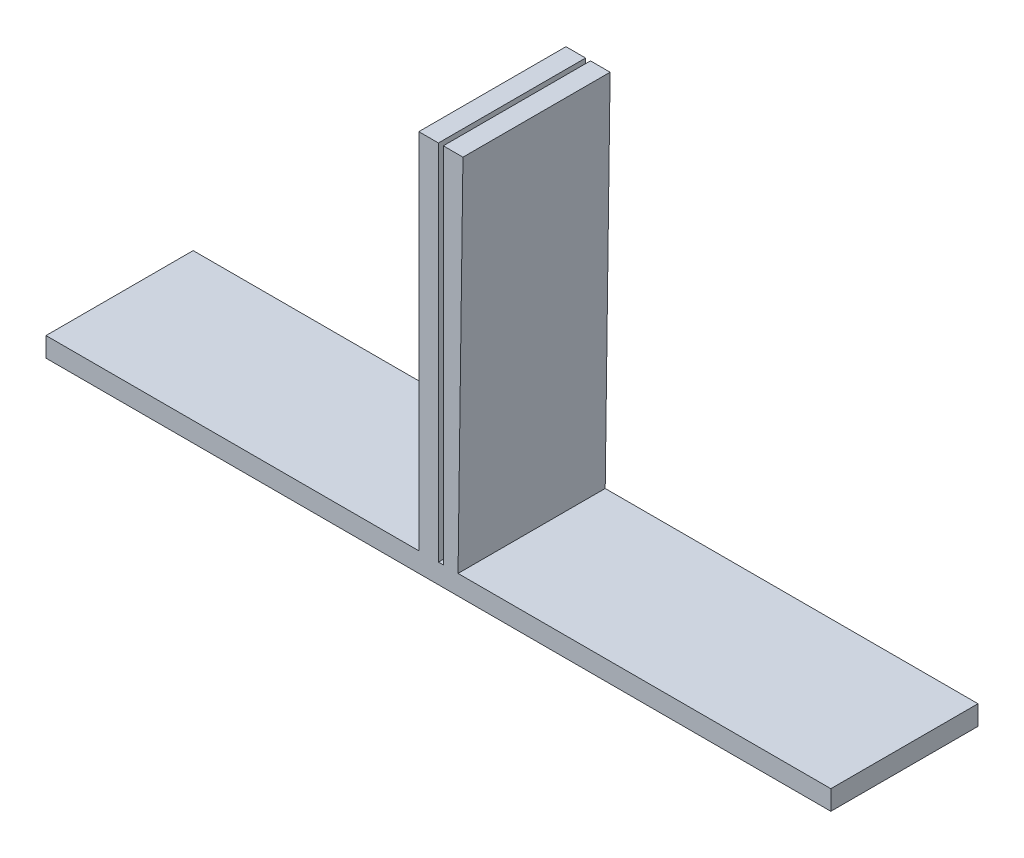
ISO-10303-21;
HEADER;
FILE_DESCRIPTION(('STEP AP214'),'2;1');
FILE_NAME('part.step','',(''),(''),'','','');
FILE_SCHEMA(('AUTOMOTIVE_DESIGN { 1 0 10303 214 1 1 1 1 }'));
ENDSEC;
DATA;
#1=APPLICATION_CONTEXT('core data for automotive mechanical design processes');
#2=APPLICATION_PROTOCOL_DEFINITION('international standard','automotive_design',2000,#1);
#3=PRODUCT_CONTEXT('',#1,'mechanical');
#4=PRODUCT('Part','Part','',(#3));
#5=PRODUCT_RELATED_PRODUCT_CATEGORY('part','',(#4));
#6=PRODUCT_DEFINITION_FORMATION('','',#4);
#7=PRODUCT_DEFINITION_CONTEXT('part definition',#1,'design');
#8=PRODUCT_DEFINITION('design','',#6,#7);
#9=PRODUCT_DEFINITION_SHAPE('','',#8);
#10=(LENGTH_UNIT() NAMED_UNIT(*) SI_UNIT(.MILLI.,.METRE.));
#11=(NAMED_UNIT(*) PLANE_ANGLE_UNIT() SI_UNIT($,.RADIAN.));
#12=(NAMED_UNIT(*) SI_UNIT($,.STERADIAN.) SOLID_ANGLE_UNIT());
#13=UNCERTAINTY_MEASURE_WITH_UNIT(LENGTH_MEASURE(1.E-05),#10,'distance_accuracy_value','');
#14=(GEOMETRIC_REPRESENTATION_CONTEXT(3) GLOBAL_UNCERTAINTY_ASSIGNED_CONTEXT((#13)) GLOBAL_UNIT_ASSIGNED_CONTEXT((#10,
#11,#12)) REPRESENTATION_CONTEXT('',''));
#15=CARTESIAN_POINT('',(0.,0.,0.));
#16=DIRECTION('',(0.,0.,1.));
#17=DIRECTION('',(1.,0.,0.));
#18=AXIS2_PLACEMENT_3D('',#15,#16,#17);
#19=CARTESIAN_POINT('',(37.1967164120741,0.,15.));
#20=DIRECTION('',(-1.,0.,0.));
#21=DIRECTION('',(0.,0.,1.));
#22=AXIS2_PLACEMENT_3D('',#19,#20,#21);
#23=PLANE('',#22);
#24=DIRECTION('',(0.,1.,0.));
#25=VECTOR('',#24,1.);
#26=CARTESIAN_POINT('',(37.1967164120741,0.,0.));
#27=LINE('',#26,#25);
#28=CARTESIAN_POINT('',(37.1967164120741,0.,0.));
#29=VERTEX_POINT('',#28);
#30=CARTESIAN_POINT('',(37.1967164120741,2.,0.));
#31=VERTEX_POINT('',#30);
#32=EDGE_CURVE('E153',#29,#31,#27,.T.);
#33=ORIENTED_EDGE('',*,*,#32,.T.);
#34=DIRECTION('',(0.,0.,-1.));
#35=VECTOR('',#34,1.);
#36=CARTESIAN_POINT('',(37.1967164120741,2.,15.));
#37=LINE('',#36,#35);
#38=CARTESIAN_POINT('',(37.1967164120741,2.,15.));
#39=VERTEX_POINT('',#38);
#40=EDGE_CURVE('E11',#39,#31,#37,.T.);
#41=ORIENTED_EDGE('',*,*,#40,.F.);
#42=DIRECTION('',(0.,1.,0.));
#43=VECTOR('',#42,1.);
#44=CARTESIAN_POINT('',(37.1967164120741,0.,15.));
#45=LINE('',#44,#43);
#46=CARTESIAN_POINT('',(37.1967164120741,0.,15.));
#47=VERTEX_POINT('',#46);
#48=EDGE_CURVE('E175',#47,#39,#45,.T.);
#49=ORIENTED_EDGE('',*,*,#48,.F.);
#50=DIRECTION('',(0.,0.,-1.));
#51=VECTOR('',#50,1.);
#52=CARTESIAN_POINT('',(37.1967164120741,0.,15.));
#53=LINE('',#52,#51);
#54=EDGE_CURVE('E149',#47,#29,#53,.T.);
#55=ORIENTED_EDGE('',*,*,#54,.T.);
#56=EDGE_LOOP('',(#33,#41,#49,#55));
#57=FACE_BOUND('',#56,.T.);
#58=ADVANCED_FACE('F33',(#57),#23,.F.);
#59=CARTESIAN_POINT('',(37.1967164120741,2.,15.));
#60=DIRECTION('',(0.,-1.,0.));
#61=DIRECTION('',(1.,0.,0.));
#62=AXIS2_PLACEMENT_3D('',#59,#60,#61);
#63=PLANE('',#62);
#64=DIRECTION('',(-1.,0.,0.));
#65=VECTOR('',#64,1.);
#66=CARTESIAN_POINT('',(37.1967164120741,2.,0.));
#67=LINE('',#66,#65);
#68=CARTESIAN_POINT('',(-0.803283587925897,2.,0.));
#69=VERTEX_POINT('',#68);
#70=EDGE_CURVE('E156',#31,#69,#67,.T.);
#71=ORIENTED_EDGE('',*,*,#70,.T.);
#72=DIRECTION('',(0.,0.,-1.));
#73=VECTOR('',#72,1.);
#74=CARTESIAN_POINT('',(-0.803283587925897,2.,15.));
#75=LINE('',#74,#73);
#76=CARTESIAN_POINT('',(-0.803283587925897,2.,15.));
#77=VERTEX_POINT('',#76);
#78=EDGE_CURVE('E41',#77,#69,#75,.T.);
#79=ORIENTED_EDGE('',*,*,#78,.F.);
#80=DIRECTION('',(-1.,0.,0.));
#81=VECTOR('',#80,1.);
#82=CARTESIAN_POINT('',(37.1967164120741,2.,15.));
#83=LINE('',#82,#81);
#84=EDGE_CURVE('E104',#39,#77,#83,.T.);
#85=ORIENTED_EDGE('',*,*,#84,.F.);
#86=ORIENTED_EDGE('',*,*,#40,.T.);
#87=EDGE_LOOP('',(#71,#79,#85,#86));
#88=FACE_BOUND('',#87,.T.);
#89=ADVANCED_FACE('F253',(#88),#63,.F.);
#90=CARTESIAN_POINT('',(-0.803283587925897,2.,15.));
#91=DIRECTION('',(-0.999908689349645,0.0135134363903355,0.));
#92=DIRECTION('',(-0.0135134363903355,-0.999908689349645,0.));
#93=AXIS2_PLACEMENT_3D('',#90,#91,#92);
#94=PLANE('',#93);
#95=DIRECTION('',(0.0135134363903355,0.999908689349645,0.));
#96=VECTOR('',#95,1.);
#97=CARTESIAN_POINT('',(-0.803283587925897,2.,0.));
#98=LINE('',#97,#96);
#99=CARTESIAN_POINT('',(-0.303286441483485,38.9966215059369,0.));
#100=VERTEX_POINT('',#99);
#101=EDGE_CURVE('E158',#69,#100,#98,.T.);
#102=ORIENTED_EDGE('',*,*,#101,.T.);
#103=DIRECTION('',(0.,0.,-1.));
#104=VECTOR('',#103,1.);
#105=CARTESIAN_POINT('',(-0.303286441483485,38.9966215059369,15.));
#106=LINE('',#105,#104);
#107=CARTESIAN_POINT('',(-0.303286441483485,38.9966215059369,15.));
#108=VERTEX_POINT('',#107);
#109=EDGE_CURVE('E194',#108,#100,#106,.T.);
#110=ORIENTED_EDGE('',*,*,#109,.F.);
#111=DIRECTION('',(0.0135134363903355,0.999908689349645,0.));
#112=VECTOR('',#111,1.);
#113=CARTESIAN_POINT('',(-0.803283587925897,2.,15.));
#114=LINE('',#113,#112);
#115=EDGE_CURVE('E202',#77,#108,#114,.T.);
#116=ORIENTED_EDGE('',*,*,#115,.F.);
#117=ORIENTED_EDGE('',*,*,#78,.T.);
#118=EDGE_LOOP('',(#102,#110,#116,#117));
#119=FACE_BOUND('',#118,.T.);
#120=ADVANCED_FACE('F200',(#119),#94,.F.);
#121=CARTESIAN_POINT('',(-0.303286441483485,38.9966215059369,15.));
#122=DIRECTION('',(-0.00168924703157144,-0.999998573221215,0.));
#123=DIRECTION('',(0.999998573221215,-0.00168924703157144,0.));
#124=AXIS2_PLACEMENT_3D('',#121,#122,#123);
#125=PLANE('',#124);
#126=DIRECTION('',(-0.999998573221215,0.00168924703157144,0.));
#127=VECTOR('',#126,1.);
#128=CARTESIAN_POINT('',(-0.303286441483485,38.9966215059369,0.));
#129=LINE('',#128,#127);
#130=CARTESIAN_POINT('',(-2.30328358792592,39.,0.));
#131=VERTEX_POINT('',#130);
#132=EDGE_CURVE('E160',#100,#131,#129,.T.);
#133=ORIENTED_EDGE('',*,*,#132,.T.);
#134=DIRECTION('',(0.,0.,-1.));
#135=VECTOR('',#134,1.);
#136=CARTESIAN_POINT('',(-2.30328358792592,39.,15.));
#137=LINE('',#136,#135);
#138=CARTESIAN_POINT('',(-2.30328358792592,39.,15.));
#139=VERTEX_POINT('',#138);
#140=EDGE_CURVE('E191',#139,#131,#137,.T.);
#141=ORIENTED_EDGE('',*,*,#140,.F.);
#142=DIRECTION('',(-0.999998573221215,0.00168924703157144,0.));
#143=VECTOR('',#142,1.);
#144=CARTESIAN_POINT('',(-0.303286441483485,38.9966215059369,15.));
#145=LINE('',#144,#143);
#146=EDGE_CURVE('E220',#108,#139,#145,.T.);
#147=ORIENTED_EDGE('',*,*,#146,.F.);
#148=ORIENTED_EDGE('',*,*,#109,.T.);
#149=EDGE_LOOP('',(#133,#141,#147,#148));
#150=FACE_BOUND('',#149,.T.);
#151=ADVANCED_FACE('F211',(#150),#125,.F.);
#152=CARTESIAN_POINT('',(-2.30328358792592,39.,15.));
#153=DIRECTION('',(1.,0.,0.));
#154=DIRECTION('',(0.,0.,-1.));
#155=AXIS2_PLACEMENT_3D('',#152,#153,#154);
#156=PLANE('',#155);
#157=DIRECTION('',(0.,-1.,0.));
#158=VECTOR('',#157,1.);
#159=CARTESIAN_POINT('',(-2.30328358792592,39.,0.));
#160=LINE('',#159,#158);
#161=CARTESIAN_POINT('',(-2.30328358792592,1.99999999999999,0.));
#162=VERTEX_POINT('',#161);
#163=EDGE_CURVE('E162',#131,#162,#160,.T.);
#164=ORIENTED_EDGE('',*,*,#163,.T.);
#165=DIRECTION('',(0.,0.,-1.));
#166=VECTOR('',#165,1.);
#167=CARTESIAN_POINT('',(-2.30328358792592,1.99999999999999,15.));
#168=LINE('',#167,#166);
#169=CARTESIAN_POINT('',(-2.30328358792592,1.99999999999999,15.));
#170=VERTEX_POINT('',#169);
#171=EDGE_CURVE('E188',#170,#162,#168,.T.);
#172=ORIENTED_EDGE('',*,*,#171,.F.);
#173=DIRECTION('',(0.,-1.,0.));
#174=VECTOR('',#173,1.);
#175=CARTESIAN_POINT('',(-2.30328358792592,39.,15.));
#176=LINE('',#175,#174);
#177=EDGE_CURVE('E217',#139,#170,#176,.T.);
#178=ORIENTED_EDGE('',*,*,#177,.F.);
#179=ORIENTED_EDGE('',*,*,#140,.T.);
#180=EDGE_LOOP('',(#164,#172,#178,#179));
#181=FACE_BOUND('',#180,.T.);
#182=ADVANCED_FACE('F215',(#181),#156,.F.);
#183=CARTESIAN_POINT('',(-2.30328358792592,1.99999999999999,15.));
#184=DIRECTION('',(0.,-1.,0.));
#185=DIRECTION('',(0.,0.,-1.));
#186=AXIS2_PLACEMENT_3D('',#183,#184,#185);
#187=PLANE('',#186);
#188=DIRECTION('',(-1.,0.,0.));
#189=VECTOR('',#188,1.);
#190=CARTESIAN_POINT('',(-2.30328358792592,1.99999999999999,0.));
#191=LINE('',#190,#189);
#192=CARTESIAN_POINT('',(-2.8032835879259,1.99999999999999,0.));
#193=VERTEX_POINT('',#192);
#194=EDGE_CURVE('E164',#162,#193,#191,.T.);
#195=ORIENTED_EDGE('',*,*,#194,.T.);
#196=DIRECTION('',(0.,0.,-1.));
#197=VECTOR('',#196,1.);
#198=CARTESIAN_POINT('',(-2.8032835879259,1.99999999999999,15.));
#199=LINE('',#198,#197);
#200=CARTESIAN_POINT('',(-2.8032835879259,1.99999999999999,15.));
#201=VERTEX_POINT('',#200);
#202=EDGE_CURVE('E185',#201,#193,#199,.T.);
#203=ORIENTED_EDGE('',*,*,#202,.F.);
#204=DIRECTION('',(-1.,0.,0.));
#205=VECTOR('',#204,1.);
#206=CARTESIAN_POINT('',(-2.30328358792592,1.99999999999999,15.));
#207=LINE('',#206,#205);
#208=EDGE_CURVE('E219',#170,#201,#207,.T.);
#209=ORIENTED_EDGE('',*,*,#208,.F.);
#210=ORIENTED_EDGE('',*,*,#171,.T.);
#211=EDGE_LOOP('',(#195,#203,#209,#210));
#212=FACE_BOUND('',#211,.T.);
#213=ADVANCED_FACE('F266',(#212),#187,.F.);
#214=CARTESIAN_POINT('',(-2.8032835879259,1.99999999999999,15.));
#215=DIRECTION('',(-1.,0.,0.));
#216=DIRECTION('',(0.,-1.,0.));
#217=AXIS2_PLACEMENT_3D('',#214,#215,#216);
#218=PLANE('',#217);
#219=DIRECTION('',(0.,1.,0.));
#220=VECTOR('',#219,1.);
#221=CARTESIAN_POINT('',(-2.8032835879259,1.99999999999999,0.));
#222=LINE('',#221,#220);
#223=CARTESIAN_POINT('',(-2.80328358792591,39.,0.));
#224=VERTEX_POINT('',#223);
#225=EDGE_CURVE('E166',#193,#224,#222,.T.);
#226=ORIENTED_EDGE('',*,*,#225,.T.);
#227=DIRECTION('',(0.,0.,-1.));
#228=VECTOR('',#227,1.);
#229=CARTESIAN_POINT('',(-2.80328358792591,39.,15.));
#230=LINE('',#229,#228);
#231=CARTESIAN_POINT('',(-2.80328358792591,39.,15.));
#232=VERTEX_POINT('',#231);
#233=EDGE_CURVE('E182',#232,#224,#230,.T.);
#234=ORIENTED_EDGE('',*,*,#233,.F.);
#235=DIRECTION('',(0.,1.,0.));
#236=VECTOR('',#235,1.);
#237=CARTESIAN_POINT('',(-2.8032835879259,1.99999999999999,15.));
#238=LINE('',#237,#236);
#239=EDGE_CURVE('E222',#201,#232,#238,.T.);
#240=ORIENTED_EDGE('',*,*,#239,.F.);
#241=ORIENTED_EDGE('',*,*,#202,.T.);
#242=EDGE_LOOP('',(#226,#234,#240,#241));
#243=FACE_BOUND('',#242,.T.);
#244=ADVANCED_FACE('F269',(#243),#218,.F.);
#245=CARTESIAN_POINT('',(-2.80328358792591,39.,15.));
#246=DIRECTION('',(0.,-1.,0.));
#247=DIRECTION('',(0.,0.,-1.));
#248=AXIS2_PLACEMENT_3D('',#245,#246,#247);
#249=PLANE('',#248);
#250=DIRECTION('',(-1.,0.,0.));
#251=VECTOR('',#250,1.);
#252=CARTESIAN_POINT('',(-2.80328358792591,39.,0.));
#253=LINE('',#252,#251);
#254=CARTESIAN_POINT('',(-4.80328358792591,39.,0.));
#255=VERTEX_POINT('',#254);
#256=EDGE_CURVE('E168',#224,#255,#253,.T.);
#257=ORIENTED_EDGE('',*,*,#256,.T.);
#258=DIRECTION('',(0.,0.,-1.));
#259=VECTOR('',#258,1.);
#260=CARTESIAN_POINT('',(-4.80328358792591,39.,15.));
#261=LINE('',#260,#259);
#262=CARTESIAN_POINT('',(-4.80328358792591,39.,15.));
#263=VERTEX_POINT('',#262);
#264=EDGE_CURVE('E179',#263,#255,#261,.T.);
#265=ORIENTED_EDGE('',*,*,#264,.F.);
#266=DIRECTION('',(-1.,0.,0.));
#267=VECTOR('',#266,1.);
#268=CARTESIAN_POINT('',(-2.80328358792591,39.,15.));
#269=LINE('',#268,#267);
#270=EDGE_CURVE('E228',#232,#263,#269,.T.);
#271=ORIENTED_EDGE('',*,*,#270,.F.);
#272=ORIENTED_EDGE('',*,*,#233,.T.);
#273=EDGE_LOOP('',(#257,#265,#271,#272));
#274=FACE_BOUND('',#273,.T.);
#275=ADVANCED_FACE('F234',(#274),#249,.F.);
#276=CARTESIAN_POINT('',(-4.80328358792591,39.,15.));
#277=DIRECTION('',(1.,0.,0.));
#278=DIRECTION('',(0.,1.,0.));
#279=AXIS2_PLACEMENT_3D('',#276,#277,#278);
#280=PLANE('',#279);
#281=DIRECTION('',(0.,-1.,0.));
#282=VECTOR('',#281,1.);
#283=CARTESIAN_POINT('',(-4.80328358792591,39.,0.));
#284=LINE('',#283,#282);
#285=CARTESIAN_POINT('',(-4.80328358792591,2.,0.));
#286=VERTEX_POINT('',#285);
#287=EDGE_CURVE('E170',#255,#286,#284,.T.);
#288=ORIENTED_EDGE('',*,*,#287,.T.);
#289=DIRECTION('',(0.,0.,-1.));
#290=VECTOR('',#289,1.);
#291=CARTESIAN_POINT('',(-4.80328358792591,2.,15.));
#292=LINE('',#291,#290);
#293=CARTESIAN_POINT('',(-4.80328358792591,2.,15.));
#294=VERTEX_POINT('',#293);
#295=EDGE_CURVE('E144',#294,#286,#292,.T.);
#296=ORIENTED_EDGE('',*,*,#295,.F.);
#297=DIRECTION('',(0.,-1.,0.));
#298=VECTOR('',#297,1.);
#299=CARTESIAN_POINT('',(-4.80328358792591,39.,15.));
#300=LINE('',#299,#298);
#301=EDGE_CURVE('E135',#263,#294,#300,.T.);
#302=ORIENTED_EDGE('',*,*,#301,.F.);
#303=ORIENTED_EDGE('',*,*,#264,.T.);
#304=EDGE_LOOP('',(#288,#296,#302,#303));
#305=FACE_BOUND('',#304,.T.);
#306=ADVANCED_FACE('F238',(#305),#280,.F.);
#307=CARTESIAN_POINT('',(-4.80328358792591,2.,15.));
#308=DIRECTION('',(0.,-1.,0.));
#309=DIRECTION('',(1.,0.,0.));
#310=AXIS2_PLACEMENT_3D('',#307,#308,#309);
#311=PLANE('',#310);
#312=DIRECTION('',(-1.,0.,0.));
#313=VECTOR('',#312,1.);
#314=CARTESIAN_POINT('',(-4.80328358792591,2.,0.));
#315=LINE('',#314,#313);
#316=CARTESIAN_POINT('',(-42.8032835879259,1.99999999999999,0.));
#317=VERTEX_POINT('',#316);
#318=EDGE_CURVE('E143',#286,#317,#315,.T.);
#319=ORIENTED_EDGE('',*,*,#318,.T.);
#320=DIRECTION('',(0.,0.,-1.));
#321=VECTOR('',#320,1.);
#322=CARTESIAN_POINT('',(-42.8032835879259,1.99999999999999,15.));
#323=LINE('',#322,#321);
#324=CARTESIAN_POINT('',(-42.8032835879259,1.99999999999999,15.));
#325=VERTEX_POINT('',#324);
#326=EDGE_CURVE('E140',#325,#317,#323,.T.);
#327=ORIENTED_EDGE('',*,*,#326,.F.);
#328=DIRECTION('',(-1.,0.,0.));
#329=VECTOR('',#328,1.);
#330=CARTESIAN_POINT('',(-4.80328358792591,2.,15.));
#331=LINE('',#330,#329);
#332=EDGE_CURVE('E129',#294,#325,#331,.T.);
#333=ORIENTED_EDGE('',*,*,#332,.F.);
#334=ORIENTED_EDGE('',*,*,#295,.T.);
#335=EDGE_LOOP('',(#319,#327,#333,#334));
#336=FACE_BOUND('',#335,.T.);
#337=ADVANCED_FACE('F141',(#336),#311,.F.);
#338=CARTESIAN_POINT('',(-42.8032835879259,1.99999999999999,15.));
#339=DIRECTION('',(1.,0.,0.));
#340=DIRECTION('',(0.,0.,-1.));
#341=AXIS2_PLACEMENT_3D('',#338,#339,#340);
#342=PLANE('',#341);
#343=DIRECTION('',(0.,-1.,0.));
#344=VECTOR('',#343,1.);
#345=CARTESIAN_POINT('',(-42.8032835879259,1.99999999999999,0.));
#346=LINE('',#345,#344);
#347=CARTESIAN_POINT('',(-42.8032835879259,0.,0.));
#348=VERTEX_POINT('',#347);
#349=EDGE_CURVE('E90',#317,#348,#346,.T.);
#350=ORIENTED_EDGE('',*,*,#349,.T.);
#351=DIRECTION('',(0.,0.,-1.));
#352=VECTOR('',#351,1.);
#353=CARTESIAN_POINT('',(-42.8032835879259,0.,15.));
#354=LINE('',#353,#352);
#355=CARTESIAN_POINT('',(-42.8032835879259,0.,15.));
#356=VERTEX_POINT('',#355);
#357=EDGE_CURVE('E145',#356,#348,#354,.T.);
#358=ORIENTED_EDGE('',*,*,#357,.F.);
#359=DIRECTION('',(0.,-1.,0.));
#360=VECTOR('',#359,1.);
#361=CARTESIAN_POINT('',(-42.8032835879259,1.99999999999999,15.));
#362=LINE('',#361,#360);
#363=EDGE_CURVE('E133',#325,#356,#362,.T.);
#364=ORIENTED_EDGE('',*,*,#363,.F.);
#365=ORIENTED_EDGE('',*,*,#326,.T.);
#366=EDGE_LOOP('',(#350,#358,#364,#365));
#367=FACE_BOUND('',#366,.T.);
#368=ADVANCED_FACE('F147',(#367),#342,.F.);
#369=CARTESIAN_POINT('',(37.1967164120741,0.,15.));
#370=DIRECTION('',(0.,1.,0.));
#371=DIRECTION('',(0.,0.,1.));
#372=AXIS2_PLACEMENT_3D('',#369,#370,#371);
#373=PLANE('',#372);
#374=DIRECTION('',(1.,0.,0.));
#375=VECTOR('',#374,1.);
#376=CARTESIAN_POINT('',(37.1967164120741,0.,0.));
#377=LINE('',#376,#375);
#378=EDGE_CURVE('E96',#348,#29,#377,.T.);
#379=ORIENTED_EDGE('',*,*,#378,.T.);
#380=ORIENTED_EDGE('',*,*,#54,.F.);
#381=DIRECTION('',(1.,0.,0.));
#382=VECTOR('',#381,1.);
#383=CARTESIAN_POINT('',(37.1967164120741,0.,15.));
#384=LINE('',#383,#382);
#385=EDGE_CURVE('E49',#356,#47,#384,.T.);
#386=ORIENTED_EDGE('',*,*,#385,.F.);
#387=ORIENTED_EDGE('',*,*,#357,.T.);
#388=EDGE_LOOP('',(#379,#380,#386,#387));
#389=FACE_BOUND('',#388,.T.);
#390=ADVANCED_FACE('F242',(#389),#373,.F.);
#391=CARTESIAN_POINT('',(0.,0.,15.));
#392=DIRECTION('',(0.,0.,1.));
#393=DIRECTION('',(1.,0.,0.));
#394=AXIS2_PLACEMENT_3D('',#391,#392,#393);
#395=PLANE('',#394);
#396=ORIENTED_EDGE('',*,*,#48,.T.);
#397=ORIENTED_EDGE('',*,*,#84,.T.);
#398=ORIENTED_EDGE('',*,*,#115,.T.);
#399=ORIENTED_EDGE('',*,*,#146,.T.);
#400=ORIENTED_EDGE('',*,*,#177,.T.);
#401=ORIENTED_EDGE('',*,*,#208,.T.);
#402=ORIENTED_EDGE('',*,*,#239,.T.);
#403=ORIENTED_EDGE('',*,*,#270,.T.);
#404=ORIENTED_EDGE('',*,*,#301,.T.);
#405=ORIENTED_EDGE('',*,*,#332,.T.);
#406=ORIENTED_EDGE('',*,*,#363,.T.);
#407=ORIENTED_EDGE('',*,*,#385,.T.);
#408=EDGE_LOOP('',(#396,#397,#398,#399,#400,#401,#402,#403,#404,#405,#406,#407));
#409=FACE_BOUND('',#408,.T.);
#410=ADVANCED_FACE('F131',(#409),#395,.T.);
#411=CARTESIAN_POINT('',(0.,0.,0.));
#412=DIRECTION('',(0.,0.,1.));
#413=DIRECTION('',(1.,0.,0.));
#414=AXIS2_PLACEMENT_3D('',#411,#412,#413);
#415=PLANE('',#414);
#416=ORIENTED_EDGE('',*,*,#32,.F.);
#417=ORIENTED_EDGE('',*,*,#378,.F.);
#418=ORIENTED_EDGE('',*,*,#349,.F.);
#419=ORIENTED_EDGE('',*,*,#318,.F.);
#420=ORIENTED_EDGE('',*,*,#287,.F.);
#421=ORIENTED_EDGE('',*,*,#256,.F.);
#422=ORIENTED_EDGE('',*,*,#225,.F.);
#423=ORIENTED_EDGE('',*,*,#194,.F.);
#424=ORIENTED_EDGE('',*,*,#163,.F.);
#425=ORIENTED_EDGE('',*,*,#132,.F.);
#426=ORIENTED_EDGE('',*,*,#101,.F.);
#427=ORIENTED_EDGE('',*,*,#70,.F.);
#428=EDGE_LOOP('',(#416,#417,#418,#419,#420,#421,#422,#423,#424,#425,#426,#427));
#429=FACE_BOUND('',#428,.T.);
#430=ADVANCED_FACE('F206',(#429),#415,.F.);
#431=CLOSED_SHELL('',(#58,#89,#120,#151,#182,#213,#244,#275,#306,#337,#368,#390,#410,#430));
#432=MANIFOLD_SOLID_BREP('B2',#431);
#433=ADVANCED_BREP_SHAPE_REPRESENTATION('',(#18,#432),#14);
#434=SHAPE_DEFINITION_REPRESENTATION(#9,#433);
ENDSEC;
END-ISO-10303-21;
